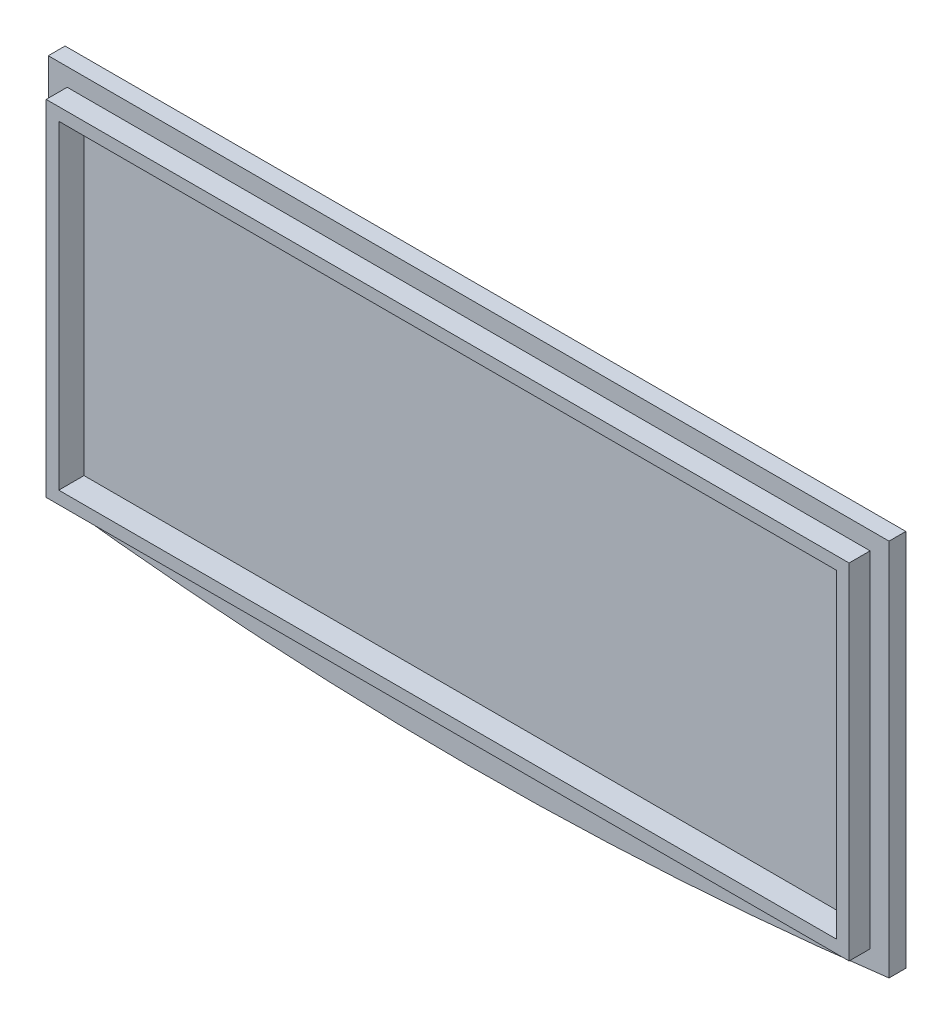
ISO-10303-21;
HEADER;
FILE_DESCRIPTION(('STEP AP214'),'2;1');
FILE_NAME('part.step','',(''),(''),'','','');
FILE_SCHEMA(('AUTOMOTIVE_DESIGN { 1 0 10303 214 1 1 1 1 }'));
ENDSEC;
DATA;
#1=APPLICATION_CONTEXT('core data for automotive mechanical design processes');
#2=APPLICATION_PROTOCOL_DEFINITION('international standard','automotive_design',2000,#1);
#3=PRODUCT_CONTEXT('',#1,'mechanical');
#4=PRODUCT('Part','Part','',(#3));
#5=PRODUCT_RELATED_PRODUCT_CATEGORY('part','',(#4));
#6=PRODUCT_DEFINITION_FORMATION('','',#4);
#7=PRODUCT_DEFINITION_CONTEXT('part definition',#1,'design');
#8=PRODUCT_DEFINITION('design','',#6,#7);
#9=PRODUCT_DEFINITION_SHAPE('','',#8);
#10=(LENGTH_UNIT() NAMED_UNIT(*) SI_UNIT(.MILLI.,.METRE.));
#11=(NAMED_UNIT(*) PLANE_ANGLE_UNIT() SI_UNIT($,.RADIAN.));
#12=(NAMED_UNIT(*) SI_UNIT($,.STERADIAN.) SOLID_ANGLE_UNIT());
#13=UNCERTAINTY_MEASURE_WITH_UNIT(LENGTH_MEASURE(1.E-05),#10,'distance_accuracy_value','');
#14=(GEOMETRIC_REPRESENTATION_CONTEXT(3) GLOBAL_UNCERTAINTY_ASSIGNED_CONTEXT((#13)) GLOBAL_UNIT_ASSIGNED_CONTEXT((#10,
#11,#12)) REPRESENTATION_CONTEXT('',''));
#15=CARTESIAN_POINT('',(0.,0.,0.));
#16=DIRECTION('',(0.,0.,1.));
#17=DIRECTION('',(1.,0.,0.));
#18=AXIS2_PLACEMENT_3D('',#15,#16,#17);
#19=CARTESIAN_POINT('',(-90.4205664671254,0.,1.6));
#20=DIRECTION('',(-1.,0.,0.));
#21=DIRECTION('',(0.,0.,1.));
#22=AXIS2_PLACEMENT_3D('',#19,#20,#21);
#23=PLANE('',#22);
#24=DIRECTION('',(0.,1.,0.));
#25=VECTOR('',#24,1.);
#26=CARTESIAN_POINT('',(-90.4205664671254,0.,0.));
#27=LINE('',#26,#25);
#28=CARTESIAN_POINT('',(-90.4205664671254,-29.6673284821631,0.));
#29=VERTEX_POINT('',#28);
#30=CARTESIAN_POINT('',(-90.4205664671254,6.33267151783695,0.));
#31=VERTEX_POINT('',#30);
#32=EDGE_CURVE('E222',#29,#31,#27,.T.);
#33=ORIENTED_EDGE('',*,*,#32,.F.);
#34=DIRECTION('',(0.,0.,-1.));
#35=VECTOR('',#34,1.);
#36=CARTESIAN_POINT('',(-90.4205664671254,-29.6673284821631,1.6));
#37=LINE('',#36,#35);
#38=CARTESIAN_POINT('',(-90.4205664671254,-29.6673284821631,1.6));
#39=VERTEX_POINT('',#38);
#40=EDGE_CURVE('E11',#39,#29,#37,.T.);
#41=ORIENTED_EDGE('',*,*,#40,.F.);
#42=DIRECTION('',(0.,1.,0.));
#43=VECTOR('',#42,1.);
#44=CARTESIAN_POINT('',(-90.4205664671254,0.,1.6));
#45=LINE('',#44,#43);
#46=CARTESIAN_POINT('',(-90.4205664671254,6.33267151783695,1.6));
#47=VERTEX_POINT('',#46);
#48=EDGE_CURVE('E223',#39,#47,#45,.T.);
#49=ORIENTED_EDGE('',*,*,#48,.T.);
#50=DIRECTION('',(0.,0.,-1.));
#51=VECTOR('',#50,1.);
#52=CARTESIAN_POINT('',(-90.4205664671254,6.33267151783695,1.6));
#53=LINE('',#52,#51);
#54=EDGE_CURVE('E237',#47,#31,#53,.T.);
#55=ORIENTED_EDGE('',*,*,#54,.T.);
#56=EDGE_LOOP('',(#33,#41,#49,#55));
#57=FACE_BOUND('',#56,.T.);
#58=ADVANCED_FACE('F45',(#57),#23,.T.);
#59=CARTESIAN_POINT('',(-50.4205664671254,289.586586920608,1.6));
#60=DIRECTION('',(0.,0.,-1.));
#61=DIRECTION('',(-1.,0.,0.));
#62=AXIS2_PLACEMENT_3D('',#59,#60,#61);
#63=CYLINDRICAL_SURFACE('',#62,321.75);
#64=CARTESIAN_POINT('',(-50.4205664671254,289.586586920608,0.));
#65=DIRECTION('',(0.,0.,1.));
#66=DIRECTION('',(1.,0.,0.));
#67=AXIS2_PLACEMENT_3D('',#64,#65,#66);
#68=CIRCLE('',#67,321.75);
#69=CARTESIAN_POINT('',(-10.4205664671254,-29.6673284821631,0.));
#70=VERTEX_POINT('',#69);
#71=EDGE_CURVE('E241',#29,#70,#68,.T.);
#72=ORIENTED_EDGE('',*,*,#71,.T.);
#73=DIRECTION('',(0.,0.,-1.));
#74=VECTOR('',#73,1.);
#75=CARTESIAN_POINT('',(-10.4205664671254,-29.6673284821631,1.6));
#76=LINE('',#75,#74);
#77=CARTESIAN_POINT('',(-10.4205664671254,-29.6673284821631,1.6));
#78=VERTEX_POINT('',#77);
#79=EDGE_CURVE('E53',#78,#70,#76,.T.);
#80=ORIENTED_EDGE('',*,*,#79,.F.);
#81=CARTESIAN_POINT('',(-50.4205664671254,289.586586920608,1.6));
#82=DIRECTION('',(0.,0.,1.));
#83=DIRECTION('',(1.,0.,0.));
#84=AXIS2_PLACEMENT_3D('',#81,#82,#83);
#85=CIRCLE('',#84,321.75);
#86=EDGE_CURVE('E227',#39,#78,#85,.T.);
#87=ORIENTED_EDGE('',*,*,#86,.F.);
#88=ORIENTED_EDGE('',*,*,#40,.T.);
#89=EDGE_LOOP('',(#72,#80,#87,#88));
#90=FACE_BOUND('',#89,.T.);
#91=ADVANCED_FACE('F277',(#90),#63,.T.);
#92=CARTESIAN_POINT('',(-10.4205664671254,0.,1.6));
#93=DIRECTION('',(-1.,0.,0.));
#94=DIRECTION('',(0.,0.,1.));
#95=AXIS2_PLACEMENT_3D('',#92,#93,#94);
#96=PLANE('',#95);
#97=DIRECTION('',(0.,1.,0.));
#98=VECTOR('',#97,1.);
#99=CARTESIAN_POINT('',(-10.4205664671254,0.,0.));
#100=LINE('',#99,#98);
#101=CARTESIAN_POINT('',(-10.4205664671254,6.33267151783695,0.));
#102=VERTEX_POINT('',#101);
#103=EDGE_CURVE('E244',#70,#102,#100,.T.);
#104=ORIENTED_EDGE('',*,*,#103,.T.);
#105=DIRECTION('',(0.,0.,-1.));
#106=VECTOR('',#105,1.);
#107=CARTESIAN_POINT('',(-10.4205664671254,6.33267151783695,1.6));
#108=LINE('',#107,#106);
#109=CARTESIAN_POINT('',(-10.4205664671254,6.33267151783695,1.6));
#110=VERTEX_POINT('',#109);
#111=EDGE_CURVE('E252',#110,#102,#108,.T.);
#112=ORIENTED_EDGE('',*,*,#111,.F.);
#113=DIRECTION('',(0.,1.,0.));
#114=VECTOR('',#113,1.);
#115=CARTESIAN_POINT('',(-10.4205664671254,0.,1.6));
#116=LINE('',#115,#114);
#117=EDGE_CURVE('E231',#78,#110,#116,.T.);
#118=ORIENTED_EDGE('',*,*,#117,.F.);
#119=ORIENTED_EDGE('',*,*,#79,.T.);
#120=EDGE_LOOP('',(#104,#112,#118,#119));
#121=FACE_BOUND('',#120,.T.);
#122=ADVANCED_FACE('F261',(#121),#96,.F.);
#123=CARTESIAN_POINT('',(0.,6.33267151783695,1.6));
#124=DIRECTION('',(0.,-1.,0.));
#125=DIRECTION('',(0.,0.,-1.));
#126=AXIS2_PLACEMENT_3D('',#123,#124,#125);
#127=PLANE('',#126);
#128=DIRECTION('',(-1.,0.,0.));
#129=VECTOR('',#128,1.);
#130=CARTESIAN_POINT('',(0.,6.33267151783695,0.));
#131=LINE('',#130,#129);
#132=EDGE_CURVE('E228',#102,#31,#131,.T.);
#133=ORIENTED_EDGE('',*,*,#132,.T.);
#134=ORIENTED_EDGE('',*,*,#54,.F.);
#135=DIRECTION('',(-1.,0.,0.));
#136=VECTOR('',#135,1.);
#137=CARTESIAN_POINT('',(0.,6.33267151783695,1.6));
#138=LINE('',#137,#136);
#139=EDGE_CURVE('E234',#110,#47,#138,.T.);
#140=ORIENTED_EDGE('',*,*,#139,.F.);
#141=ORIENTED_EDGE('',*,*,#111,.T.);
#142=EDGE_LOOP('',(#133,#134,#140,#141));
#143=FACE_BOUND('',#142,.T.);
#144=ADVANCED_FACE('F272',(#143),#127,.F.);
#145=CARTESIAN_POINT('',(0.,0.,1.6));
#146=DIRECTION('',(0.,0.,1.));
#147=DIRECTION('',(1.,0.,0.));
#148=AXIS2_PLACEMENT_3D('',#145,#146,#147);
#149=PLANE('',#148);
#150=DIRECTION('',(0.,1.,0.));
#151=VECTOR('',#150,1.);
#152=CARTESIAN_POINT('',(-12.2205664671254,4.63267151783695,1.6));
#153=LINE('',#152,#151);
#154=CARTESIAN_POINT('',(-12.2205664671254,-28.1673284821631,1.6));
#155=VERTEX_POINT('',#154);
#156=CARTESIAN_POINT('',(-12.2205664671254,4.63267151783695,1.6));
#157=VERTEX_POINT('',#156);
#158=EDGE_CURVE('E68',#155,#157,#153,.T.);
#159=ORIENTED_EDGE('',*,*,#158,.F.);
#160=DIRECTION('',(1.,0.,0.));
#161=VECTOR('',#160,1.);
#162=CARTESIAN_POINT('',(-88.6205664671254,-28.1673284821631,1.6));
#163=LINE('',#162,#161);
#164=CARTESIAN_POINT('',(-88.6205664671254,-28.1673284821631,1.6));
#165=VERTEX_POINT('',#164);
#166=EDGE_CURVE('E185',#165,#155,#163,.T.);
#167=ORIENTED_EDGE('',*,*,#166,.F.);
#168=DIRECTION('',(0.,-1.,0.));
#169=VECTOR('',#168,1.);
#170=CARTESIAN_POINT('',(-88.6205664671254,4.63267151783695,1.6));
#171=LINE('',#170,#169);
#172=CARTESIAN_POINT('',(-88.6205664671254,4.63267151783695,1.6));
#173=VERTEX_POINT('',#172);
#174=EDGE_CURVE('E201',#173,#165,#171,.T.);
#175=ORIENTED_EDGE('',*,*,#174,.F.);
#176=DIRECTION('',(-1.,0.,0.));
#177=VECTOR('',#176,1.);
#178=CARTESIAN_POINT('',(-88.6205664671254,4.63267151783695,1.6));
#179=LINE('',#178,#177);
#180=EDGE_CURVE('E197',#157,#173,#179,.T.);
#181=ORIENTED_EDGE('',*,*,#180,.F.);
#182=EDGE_LOOP('',(#159,#167,#175,#181));
#183=FACE_BOUND('',#182,.T.);
#184=ORIENTED_EDGE('',*,*,#48,.F.);
#185=ORIENTED_EDGE('',*,*,#86,.T.);
#186=ORIENTED_EDGE('',*,*,#117,.T.);
#187=ORIENTED_EDGE('',*,*,#139,.T.);
#188=EDGE_LOOP('',(#184,#185,#186,#187));
#189=FACE_BOUND('',#188,.T.);
#190=ADVANCED_FACE('F276',(#183,#189),#149,.T.);
#191=CARTESIAN_POINT('',(0.,0.,0.));
#192=DIRECTION('',(0.,0.,1.));
#193=DIRECTION('',(1.,0.,0.));
#194=AXIS2_PLACEMENT_3D('',#191,#192,#193);
#195=PLANE('',#194);
#196=ORIENTED_EDGE('',*,*,#32,.T.);
#197=ORIENTED_EDGE('',*,*,#132,.F.);
#198=ORIENTED_EDGE('',*,*,#103,.F.);
#199=ORIENTED_EDGE('',*,*,#71,.F.);
#200=EDGE_LOOP('',(#196,#197,#198,#199));
#201=FACE_BOUND('',#200,.T.);
#202=ADVANCED_FACE('F268',(#201),#195,.F.);
#203=CARTESIAN_POINT('',(-12.2205664671254,4.63267151783695,3.6));
#204=DIRECTION('',(-1.,0.,0.));
#205=DIRECTION('',(0.,0.,1.));
#206=AXIS2_PLACEMENT_3D('',#203,#204,#205);
#207=PLANE('',#206);
#208=ORIENTED_EDGE('',*,*,#158,.T.);
#209=DIRECTION('',(0.,0.,-1.));
#210=VECTOR('',#209,1.);
#211=CARTESIAN_POINT('',(-12.2205664671254,4.63267151783695,3.6));
#212=LINE('',#211,#210);
#213=CARTESIAN_POINT('',(-12.2205664671254,4.63267151783695,3.6));
#214=VERTEX_POINT('',#213);
#215=EDGE_CURVE('E218',#214,#157,#212,.T.);
#216=ORIENTED_EDGE('',*,*,#215,.F.);
#217=DIRECTION('',(0.,1.,0.));
#218=VECTOR('',#217,1.);
#219=CARTESIAN_POINT('',(-12.2205664671254,4.63267151783695,3.6));
#220=LINE('',#219,#218);
#221=CARTESIAN_POINT('',(-12.2205664671254,-28.1673284821631,3.6));
#222=VERTEX_POINT('',#221);
#223=EDGE_CURVE('E180',#222,#214,#220,.T.);
#224=ORIENTED_EDGE('',*,*,#223,.F.);
#225=DIRECTION('',(0.,0.,-1.));
#226=VECTOR('',#225,1.);
#227=CARTESIAN_POINT('',(-12.2205664671254,-28.1673284821631,3.6));
#228=LINE('',#227,#226);
#229=EDGE_CURVE('E194',#222,#155,#228,.T.);
#230=ORIENTED_EDGE('',*,*,#229,.T.);
#231=EDGE_LOOP('',(#208,#216,#224,#230));
#232=FACE_BOUND('',#231,.T.);
#233=ADVANCED_FACE('F292',(#232),#207,.F.);
#234=CARTESIAN_POINT('',(-88.6205664671254,4.63267151783695,3.6));
#235=DIRECTION('',(0.,-1.,0.));
#236=DIRECTION('',(0.,0.,-1.));
#237=AXIS2_PLACEMENT_3D('',#234,#235,#236);
#238=PLANE('',#237);
#239=ORIENTED_EDGE('',*,*,#180,.T.);
#240=DIRECTION('',(0.,0.,-1.));
#241=VECTOR('',#240,1.);
#242=CARTESIAN_POINT('',(-88.6205664671254,4.63267151783695,3.6));
#243=LINE('',#242,#241);
#244=CARTESIAN_POINT('',(-88.6205664671254,4.63267151783695,3.6));
#245=VERTEX_POINT('',#244);
#246=EDGE_CURVE('E214',#245,#173,#243,.T.);
#247=ORIENTED_EDGE('',*,*,#246,.F.);
#248=DIRECTION('',(-1.,0.,0.));
#249=VECTOR('',#248,1.);
#250=CARTESIAN_POINT('',(-88.6205664671254,4.63267151783695,3.6));
#251=LINE('',#250,#249);
#252=EDGE_CURVE('E184',#214,#245,#251,.T.);
#253=ORIENTED_EDGE('',*,*,#252,.F.);
#254=ORIENTED_EDGE('',*,*,#215,.T.);
#255=EDGE_LOOP('',(#239,#247,#253,#254));
#256=FACE_BOUND('',#255,.T.);
#257=ADVANCED_FACE('F297',(#256),#238,.F.);
#258=CARTESIAN_POINT('',(-88.6205664671254,4.63267151783695,3.6));
#259=DIRECTION('',(1.,0.,0.));
#260=DIRECTION('',(0.,0.,-1.));
#261=AXIS2_PLACEMENT_3D('',#258,#259,#260);
#262=PLANE('',#261);
#263=ORIENTED_EDGE('',*,*,#174,.T.);
#264=DIRECTION('',(0.,0.,-1.));
#265=VECTOR('',#264,1.);
#266=CARTESIAN_POINT('',(-88.6205664671254,-28.1673284821631,3.6));
#267=LINE('',#266,#265);
#268=CARTESIAN_POINT('',(-88.6205664671254,-28.1673284821631,3.6));
#269=VERTEX_POINT('',#268);
#270=EDGE_CURVE('E210',#269,#165,#267,.T.);
#271=ORIENTED_EDGE('',*,*,#270,.F.);
#272=DIRECTION('',(0.,-1.,0.));
#273=VECTOR('',#272,1.);
#274=CARTESIAN_POINT('',(-88.6205664671254,4.63267151783695,3.6));
#275=LINE('',#274,#273);
#276=EDGE_CURVE('E188',#245,#269,#275,.T.);
#277=ORIENTED_EDGE('',*,*,#276,.F.);
#278=ORIENTED_EDGE('',*,*,#246,.T.);
#279=EDGE_LOOP('',(#263,#271,#277,#278));
#280=FACE_BOUND('',#279,.T.);
#281=ADVANCED_FACE('F301',(#280),#262,.F.);
#282=CARTESIAN_POINT('',(-88.6205664671254,-28.1673284821631,3.6));
#283=DIRECTION('',(0.,1.,0.));
#284=DIRECTION('',(0.,0.,1.));
#285=AXIS2_PLACEMENT_3D('',#282,#283,#284);
#286=PLANE('',#285);
#287=ORIENTED_EDGE('',*,*,#166,.T.);
#288=ORIENTED_EDGE('',*,*,#229,.F.);
#289=DIRECTION('',(1.,0.,0.));
#290=VECTOR('',#289,1.);
#291=CARTESIAN_POINT('',(-88.6205664671254,-28.1673284821631,3.6));
#292=LINE('',#291,#290);
#293=EDGE_CURVE('E191',#269,#222,#292,.T.);
#294=ORIENTED_EDGE('',*,*,#293,.F.);
#295=ORIENTED_EDGE('',*,*,#270,.T.);
#296=EDGE_LOOP('',(#287,#288,#294,#295));
#297=FACE_BOUND('',#296,.T.);
#298=ADVANCED_FACE('F305',(#297),#286,.F.);
#299=CARTESIAN_POINT('',(0.,0.,3.6));
#300=DIRECTION('',(0.,0.,1.));
#301=DIRECTION('',(1.,0.,0.));
#302=AXIS2_PLACEMENT_3D('',#299,#300,#301);
#303=PLANE('',#302);
#304=DIRECTION('',(0.,1.,0.));
#305=VECTOR('',#304,1.);
#306=CARTESIAN_POINT('',(-13.4205664671254,4.63267151783695,3.6));
#307=LINE('',#306,#305);
#308=CARTESIAN_POINT('',(-13.4205664671254,-26.9673284821631,3.6));
#309=VERTEX_POINT('',#308);
#310=CARTESIAN_POINT('',(-13.4205664671254,3.43267151783695,3.6));
#311=VERTEX_POINT('',#310);
#312=EDGE_CURVE('E134',#309,#311,#307,.T.);
#313=ORIENTED_EDGE('',*,*,#312,.F.);
#314=DIRECTION('',(1.,0.,0.));
#315=VECTOR('',#314,1.);
#316=CARTESIAN_POINT('',(-88.6205664671254,-26.9673284821631,3.6));
#317=LINE('',#316,#315);
#318=CARTESIAN_POINT('',(-87.4205664671254,-26.9673284821631,3.6));
#319=VERTEX_POINT('',#318);
#320=EDGE_CURVE('E164',#319,#309,#317,.T.);
#321=ORIENTED_EDGE('',*,*,#320,.F.);
#322=DIRECTION('',(0.,-1.,0.));
#323=VECTOR('',#322,1.);
#324=CARTESIAN_POINT('',(-87.4205664671254,4.63267151783695,3.6));
#325=LINE('',#324,#323);
#326=CARTESIAN_POINT('',(-87.4205664671254,3.43267151783695,3.6));
#327=VERTEX_POINT('',#326);
#328=EDGE_CURVE('E160',#327,#319,#325,.T.);
#329=ORIENTED_EDGE('',*,*,#328,.F.);
#330=DIRECTION('',(-1.,0.,0.));
#331=VECTOR('',#330,1.);
#332=CARTESIAN_POINT('',(-88.6205664671254,3.43267151783695,3.6));
#333=LINE('',#332,#331);
#334=EDGE_CURVE('E144',#311,#327,#333,.T.);
#335=ORIENTED_EDGE('',*,*,#334,.F.);
#336=EDGE_LOOP('',(#313,#321,#329,#335));
#337=FACE_BOUND('',#336,.T.);
#338=ORIENTED_EDGE('',*,*,#223,.T.);
#339=ORIENTED_EDGE('',*,*,#252,.T.);
#340=ORIENTED_EDGE('',*,*,#276,.T.);
#341=ORIENTED_EDGE('',*,*,#293,.T.);
#342=EDGE_LOOP('',(#338,#339,#340,#341));
#343=FACE_BOUND('',#342,.T.);
#344=ADVANCED_FACE('F158',(#337,#343),#303,.T.);
#345=CARTESIAN_POINT('',(0.,0.,1.2));
#346=DIRECTION('',(0.,0.,1.));
#347=DIRECTION('',(1.,0.,0.));
#348=AXIS2_PLACEMENT_3D('',#345,#346,#347);
#349=PLANE('',#348);
#350=DIRECTION('',(0.,1.,0.));
#351=VECTOR('',#350,1.);
#352=CARTESIAN_POINT('',(-87.4205664671254,0.,1.2));
#353=LINE('',#352,#351);
#354=CARTESIAN_POINT('',(-87.4205664671254,-26.9673284821631,1.2));
#355=VERTEX_POINT('',#354);
#356=CARTESIAN_POINT('',(-87.4205664671254,3.43267151783695,1.2));
#357=VERTEX_POINT('',#356);
#358=EDGE_CURVE('E175',#355,#357,#353,.T.);
#359=ORIENTED_EDGE('',*,*,#358,.F.);
#360=DIRECTION('',(-1.,0.,0.));
#361=VECTOR('',#360,1.);
#362=CARTESIAN_POINT('',(0.,-26.9673284821631,1.2));
#363=LINE('',#362,#361);
#364=CARTESIAN_POINT('',(-13.4205664671254,-26.9673284821631,1.2));
#365=VERTEX_POINT('',#364);
#366=EDGE_CURVE('E172',#365,#355,#363,.T.);
#367=ORIENTED_EDGE('',*,*,#366,.F.);
#368=DIRECTION('',(0.,-1.,0.));
#369=VECTOR('',#368,1.);
#370=CARTESIAN_POINT('',(-13.4205664671254,0.,1.2));
#371=LINE('',#370,#369);
#372=CARTESIAN_POINT('',(-13.4205664671254,3.43267151783695,1.2));
#373=VERTEX_POINT('',#372);
#374=EDGE_CURVE('E154',#373,#365,#371,.T.);
#375=ORIENTED_EDGE('',*,*,#374,.F.);
#376=DIRECTION('',(1.,0.,0.));
#377=VECTOR('',#376,1.);
#378=CARTESIAN_POINT('',(0.,3.43267151783695,1.2));
#379=LINE('',#378,#377);
#380=EDGE_CURVE('E152',#357,#373,#379,.T.);
#381=ORIENTED_EDGE('',*,*,#380,.F.);
#382=EDGE_LOOP('',(#359,#367,#375,#381));
#383=FACE_BOUND('',#382,.T.);
#384=ADVANCED_FACE('F312',(#383),#349,.T.);
#385=CARTESIAN_POINT('',(-13.4205664671254,4.63267151783695,3.6));
#386=DIRECTION('',(-1.,0.,0.));
#387=DIRECTION('',(0.,0.,1.));
#388=AXIS2_PLACEMENT_3D('',#385,#386,#387);
#389=PLANE('',#388);
#390=ORIENTED_EDGE('',*,*,#374,.T.);
#391=DIRECTION('',(0.,0.,-1.));
#392=VECTOR('',#391,1.);
#393=CARTESIAN_POINT('',(-13.4205664671254,-26.9673284821631,3.6));
#394=LINE('',#393,#392);
#395=EDGE_CURVE('E139',#309,#365,#394,.T.);
#396=ORIENTED_EDGE('',*,*,#395,.F.);
#397=ORIENTED_EDGE('',*,*,#312,.T.);
#398=DIRECTION('',(0.,0.,-1.));
#399=VECTOR('',#398,1.);
#400=CARTESIAN_POINT('',(-13.4205664671253,3.43267151783695,3.6));
#401=LINE('',#400,#399);
#402=EDGE_CURVE('E137',#311,#373,#401,.T.);
#403=ORIENTED_EDGE('',*,*,#402,.T.);
#404=EDGE_LOOP('',(#390,#396,#397,#403));
#405=FACE_BOUND('',#404,.T.);
#406=ADVANCED_FACE('F136',(#405),#389,.T.);
#407=CARTESIAN_POINT('',(-88.6205664671254,3.43267151783695,3.6));
#408=DIRECTION('',(0.,-1.,0.));
#409=DIRECTION('',(0.,0.,-1.));
#410=AXIS2_PLACEMENT_3D('',#407,#408,#409);
#411=PLANE('',#410);
#412=ORIENTED_EDGE('',*,*,#380,.T.);
#413=ORIENTED_EDGE('',*,*,#402,.F.);
#414=ORIENTED_EDGE('',*,*,#334,.T.);
#415=DIRECTION('',(0.,0.,-1.));
#416=VECTOR('',#415,1.);
#417=CARTESIAN_POINT('',(-87.4205664671254,3.43267151783695,3.6));
#418=LINE('',#417,#416);
#419=EDGE_CURVE('E155',#327,#357,#418,.T.);
#420=ORIENTED_EDGE('',*,*,#419,.T.);
#421=EDGE_LOOP('',(#412,#413,#414,#420));
#422=FACE_BOUND('',#421,.T.);
#423=ADVANCED_FACE('F148',(#422),#411,.T.);
#424=CARTESIAN_POINT('',(-87.4205664671254,4.63267151783695,3.6));
#425=DIRECTION('',(1.,0.,0.));
#426=DIRECTION('',(0.,0.,-1.));
#427=AXIS2_PLACEMENT_3D('',#424,#425,#426);
#428=PLANE('',#427);
#429=ORIENTED_EDGE('',*,*,#358,.T.);
#430=ORIENTED_EDGE('',*,*,#419,.F.);
#431=ORIENTED_EDGE('',*,*,#328,.T.);
#432=DIRECTION('',(0.,0.,-1.));
#433=VECTOR('',#432,1.);
#434=CARTESIAN_POINT('',(-87.4205664671254,-26.9673284821631,3.6));
#435=LINE('',#434,#433);
#436=EDGE_CURVE('E60',#319,#355,#435,.T.);
#437=ORIENTED_EDGE('',*,*,#436,.T.);
#438=EDGE_LOOP('',(#429,#430,#431,#437));
#439=FACE_BOUND('',#438,.T.);
#440=ADVANCED_FACE('F316',(#439),#428,.T.);
#441=CARTESIAN_POINT('',(-88.6205664671254,-26.9673284821631,3.6));
#442=DIRECTION('',(0.,1.,0.));
#443=DIRECTION('',(0.,0.,1.));
#444=AXIS2_PLACEMENT_3D('',#441,#442,#443);
#445=PLANE('',#444);
#446=ORIENTED_EDGE('',*,*,#366,.T.);
#447=ORIENTED_EDGE('',*,*,#436,.F.);
#448=ORIENTED_EDGE('',*,*,#320,.T.);
#449=ORIENTED_EDGE('',*,*,#395,.T.);
#450=EDGE_LOOP('',(#446,#447,#448,#449));
#451=FACE_BOUND('',#450,.T.);
#452=ADVANCED_FACE('F313',(#451),#445,.T.);
#453=CLOSED_SHELL('',(#58,#91,#122,#144,#190,#202,#233,#257,#281,#298,#344,#384,#406,#423,#440,#452));
#454=MANIFOLD_SOLID_BREP('B2',#453);
#455=ADVANCED_BREP_SHAPE_REPRESENTATION('',(#18,#454),#14);
#456=SHAPE_DEFINITION_REPRESENTATION(#9,#455);
ENDSEC;
END-ISO-10303-21;
